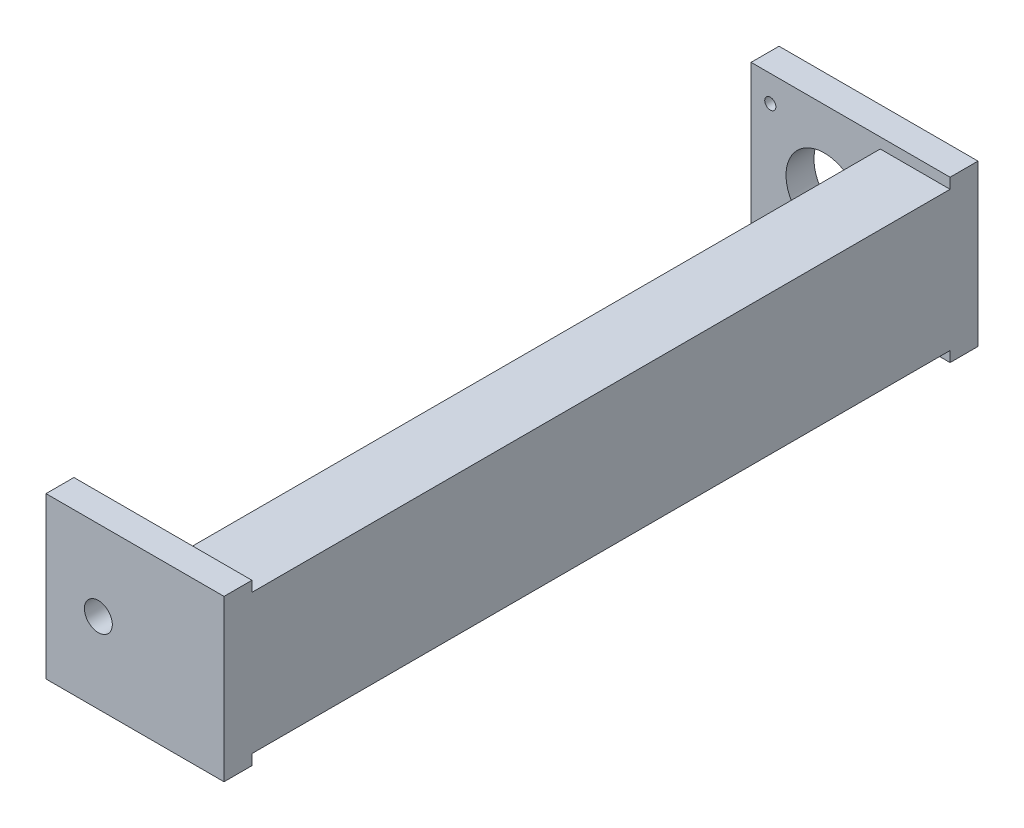
ISO-10303-21;
HEADER;
FILE_DESCRIPTION(('STEP AP214'),'2;1');
FILE_NAME('part.step','',(''),(''),'','','');
FILE_SCHEMA(('AUTOMOTIVE_DESIGN { 1 0 10303 214 1 1 1 1 }'));
ENDSEC;
DATA;
#1=APPLICATION_CONTEXT('core data for automotive mechanical design processes');
#2=APPLICATION_PROTOCOL_DEFINITION('international standard','automotive_design',2000,#1);
#3=PRODUCT_CONTEXT('',#1,'mechanical');
#4=PRODUCT('Part','Part','',(#3));
#5=PRODUCT_RELATED_PRODUCT_CATEGORY('part','',(#4));
#6=PRODUCT_DEFINITION_FORMATION('','',#4);
#7=PRODUCT_DEFINITION_CONTEXT('part definition',#1,'design');
#8=PRODUCT_DEFINITION('design','',#6,#7);
#9=PRODUCT_DEFINITION_SHAPE('','',#8);
#10=(LENGTH_UNIT() NAMED_UNIT(*) SI_UNIT(.MILLI.,.METRE.));
#11=(NAMED_UNIT(*) PLANE_ANGLE_UNIT() SI_UNIT($,.RADIAN.));
#12=(NAMED_UNIT(*) SI_UNIT($,.STERADIAN.) SOLID_ANGLE_UNIT());
#13=UNCERTAINTY_MEASURE_WITH_UNIT(LENGTH_MEASURE(1.E-05),#10,'distance_accuracy_value','');
#14=(GEOMETRIC_REPRESENTATION_CONTEXT(3) GLOBAL_UNCERTAINTY_ASSIGNED_CONTEXT((#13)) GLOBAL_UNIT_ASSIGNED_CONTEXT((#10,
#11,#12)) REPRESENTATION_CONTEXT('',''));
#15=CARTESIAN_POINT('',(0.,0.,0.));
#16=DIRECTION('',(0.,0.,1.));
#17=DIRECTION('',(1.,0.,0.));
#18=AXIS2_PLACEMENT_3D('',#15,#16,#17);
#19=CARTESIAN_POINT('',(0.,0.,8.));
#20=DIRECTION('',(0.,0.,-1.));
#21=DIRECTION('',(-1.,0.,0.));
#22=AXIS2_PLACEMENT_3D('',#19,#20,#21);
#23=PLANE('',#22);
#24=CARTESIAN_POINT('',(-23.,-15.5,8.));
#25=DIRECTION('',(0.,0.,1.));
#26=DIRECTION('',(1.,0.,0.));
#27=AXIS2_PLACEMENT_3D('',#24,#25,#26);
#28=CIRCLE('',#27,1.6);
#29=CARTESIAN_POINT('',(-21.4,-15.5,8.));
#30=VERTEX_POINT('',#29);
#31=EDGE_CURVE('E203',#30,#30,#28,.T.);
#32=ORIENTED_EDGE('',*,*,#31,.F.);
#33=EDGE_LOOP('',(#32));
#34=FACE_BOUND('',#33,.T.);
#35=CARTESIAN_POINT('',(-23.,15.5,8.));
#36=DIRECTION('',(0.,0.,1.));
#37=DIRECTION('',(1.,0.,0.));
#38=AXIS2_PLACEMENT_3D('',#35,#36,#37);
#39=CIRCLE('',#38,1.6);
#40=CARTESIAN_POINT('',(-21.4,15.5,8.));
#41=VERTEX_POINT('',#40);
#42=EDGE_CURVE('E222',#41,#41,#39,.T.);
#43=ORIENTED_EDGE('',*,*,#42,.F.);
#44=EDGE_LOOP('',(#43));
#45=FACE_BOUND('',#44,.T.);
#46=CARTESIAN_POINT('',(-7.5,0.,8.));
#47=DIRECTION('',(0.,0.,1.));
#48=DIRECTION('',(1.,0.,0.));
#49=AXIS2_PLACEMENT_3D('',#46,#47,#48);
#50=CIRCLE('',#49,11.);
#51=CARTESIAN_POINT('',(3.5,0.,8.));
#52=VERTEX_POINT('',#51);
#53=EDGE_CURVE('E228',#52,#52,#50,.T.);
#54=ORIENTED_EDGE('',*,*,#53,.F.);
#55=EDGE_LOOP('',(#54));
#56=FACE_BOUND('',#55,.T.);
#57=DIRECTION('',(0.,-1.,0.));
#58=VECTOR('',#57,1.);
#59=CARTESIAN_POINT('',(8.5,20.,8.));
#60=LINE('',#59,#58);
#61=CARTESIAN_POINT('',(8.5,13.9801315846429,8.));
#62=VERTEX_POINT('',#61);
#63=CARTESIAN_POINT('',(8.5,-13.9801315846429,8.));
#64=VERTEX_POINT('',#63);
#65=EDGE_CURVE('E11',#62,#64,#60,.T.);
#66=ORIENTED_EDGE('',*,*,#65,.F.);
#67=CARTESIAN_POINT('',(8.,15.5,8.));
#68=DIRECTION('',(0.,0.,1.));
#69=DIRECTION('',(1.,0.,0.));
#70=AXIS2_PLACEMENT_3D('',#67,#68,#69);
#71=CIRCLE('',#70,1.6);
#72=CARTESIAN_POINT('',(8.5,17.0198684153571,8.));
#73=VERTEX_POINT('',#72);
#74=EDGE_CURVE('E215',#73,#62,#71,.T.);
#75=ORIENTED_EDGE('',*,*,#74,.F.);
#76=CARTESIAN_POINT('',(8.5,20.,8.));
#77=VERTEX_POINT('',#76);
#78=EDGE_CURVE('E187',#77,#73,#60,.T.);
#79=ORIENTED_EDGE('',*,*,#78,.F.);
#80=DIRECTION('',(-1.,0.,0.));
#81=VECTOR('',#80,1.);
#82=CARTESIAN_POINT('',(28.5,20.,8.));
#83=LINE('',#82,#81);
#84=CARTESIAN_POINT('',(28.5,20.,8.));
#85=VERTEX_POINT('',#84);
#86=EDGE_CURVE('E169',#85,#77,#83,.T.);
#87=ORIENTED_EDGE('',*,*,#86,.F.);
#88=DIRECTION('',(0.,1.,0.));
#89=VECTOR('',#88,1.);
#90=CARTESIAN_POINT('',(28.5,-23.,8.));
#91=LINE('',#90,#89);
#92=CARTESIAN_POINT('',(28.5,23.,8.));
#93=VERTEX_POINT('',#92);
#94=EDGE_CURVE('E237',#85,#93,#91,.T.);
#95=ORIENTED_EDGE('',*,*,#94,.T.);
#96=DIRECTION('',(-1.,0.,0.));
#97=VECTOR('',#96,1.);
#98=CARTESIAN_POINT('',(-28.5,23.,8.));
#99=LINE('',#98,#97);
#100=CARTESIAN_POINT('',(-28.5,23.,8.));
#101=VERTEX_POINT('',#100);
#102=EDGE_CURVE('E236',#93,#101,#99,.T.);
#103=ORIENTED_EDGE('',*,*,#102,.T.);
#104=DIRECTION('',(0.,-1.,0.));
#105=VECTOR('',#104,1.);
#106=CARTESIAN_POINT('',(-28.5,-23.,8.));
#107=LINE('',#106,#105);
#108=CARTESIAN_POINT('',(-28.5,-23.,8.));
#109=VERTEX_POINT('',#108);
#110=EDGE_CURVE('E239',#101,#109,#107,.T.);
#111=ORIENTED_EDGE('',*,*,#110,.T.);
#112=DIRECTION('',(1.,0.,0.));
#113=VECTOR('',#112,1.);
#114=CARTESIAN_POINT('',(-28.5,-23.,8.));
#115=LINE('',#114,#113);
#116=CARTESIAN_POINT('',(28.5,-23.,8.));
#117=VERTEX_POINT('',#116);
#118=EDGE_CURVE('E241',#109,#117,#115,.T.);
#119=ORIENTED_EDGE('',*,*,#118,.T.);
#120=CARTESIAN_POINT('',(28.5,-20.,8.));
#121=VERTEX_POINT('',#120);
#122=EDGE_CURVE('E234',#117,#121,#91,.T.);
#123=ORIENTED_EDGE('',*,*,#122,.T.);
#124=DIRECTION('',(1.,0.,0.));
#125=VECTOR('',#124,1.);
#126=CARTESIAN_POINT('',(28.5,-20.,8.));
#127=LINE('',#126,#125);
#128=CARTESIAN_POINT('',(8.5,-20.,8.));
#129=VERTEX_POINT('',#128);
#130=EDGE_CURVE('E58',#129,#121,#127,.T.);
#131=ORIENTED_EDGE('',*,*,#130,.F.);
#132=CARTESIAN_POINT('',(8.5,-17.0198684153571,8.));
#133=VERTEX_POINT('',#132);
#134=EDGE_CURVE('E49',#133,#129,#60,.T.);
#135=ORIENTED_EDGE('',*,*,#134,.F.);
#136=CARTESIAN_POINT('',(8.,-15.5,8.));
#137=DIRECTION('',(0.,0.,1.));
#138=DIRECTION('',(1.,0.,0.));
#139=AXIS2_PLACEMENT_3D('',#136,#137,#138);
#140=CIRCLE('',#139,1.6);
#141=EDGE_CURVE('E209',#64,#133,#140,.T.);
#142=ORIENTED_EDGE('',*,*,#141,.F.);
#143=EDGE_LOOP('',(#66,#75,#79,#87,#95,#103,#111,#119,#123,#131,#135,#142));
#144=FACE_BOUND('',#143,.T.);
#145=ADVANCED_FACE('F40',(#34,#45,#56,#144),#23,.F.);
#146=CARTESIAN_POINT('',(0.,0.,0.));
#147=DIRECTION('',(0.,0.,-1.));
#148=DIRECTION('',(-1.,0.,0.));
#149=AXIS2_PLACEMENT_3D('',#146,#147,#148);
#150=PLANE('',#149);
#151=CARTESIAN_POINT('',(8.,-15.5,0.));
#152=DIRECTION('',(0.,0.,1.));
#153=DIRECTION('',(1.,0.,0.));
#154=AXIS2_PLACEMENT_3D('',#151,#152,#153);
#155=CIRCLE('',#154,1.6);
#156=CARTESIAN_POINT('',(9.6,-15.5,0.));
#157=VERTEX_POINT('',#156);
#158=EDGE_CURVE('E206',#157,#157,#155,.T.);
#159=ORIENTED_EDGE('',*,*,#158,.T.);
#160=EDGE_LOOP('',(#159));
#161=FACE_BOUND('',#160,.T.);
#162=CARTESIAN_POINT('',(-23.,15.5,0.));
#163=DIRECTION('',(0.,0.,1.));
#164=DIRECTION('',(1.,0.,0.));
#165=AXIS2_PLACEMENT_3D('',#162,#163,#164);
#166=CIRCLE('',#165,1.6);
#167=CARTESIAN_POINT('',(-21.4,15.5,0.));
#168=VERTEX_POINT('',#167);
#169=EDGE_CURVE('E218',#168,#168,#166,.T.);
#170=ORIENTED_EDGE('',*,*,#169,.T.);
#171=EDGE_LOOP('',(#170));
#172=FACE_BOUND('',#171,.T.);
#173=DIRECTION('',(0.,1.,0.));
#174=VECTOR('',#173,1.);
#175=CARTESIAN_POINT('',(28.5,-23.,0.));
#176=LINE('',#175,#174);
#177=CARTESIAN_POINT('',(28.5,-23.,0.));
#178=VERTEX_POINT('',#177);
#179=CARTESIAN_POINT('',(28.5,23.,0.));
#180=VERTEX_POINT('',#179);
#181=EDGE_CURVE('E231',#178,#180,#176,.T.);
#182=ORIENTED_EDGE('',*,*,#181,.F.);
#183=DIRECTION('',(1.,0.,0.));
#184=VECTOR('',#183,1.);
#185=CARTESIAN_POINT('',(-28.5,-23.,0.));
#186=LINE('',#185,#184);
#187=CARTESIAN_POINT('',(-28.5,-23.,0.));
#188=VERTEX_POINT('',#187);
#189=EDGE_CURVE('E249',#188,#178,#186,.T.);
#190=ORIENTED_EDGE('',*,*,#189,.F.);
#191=DIRECTION('',(0.,-1.,0.));
#192=VECTOR('',#191,1.);
#193=CARTESIAN_POINT('',(-28.5,-23.,0.));
#194=LINE('',#193,#192);
#195=CARTESIAN_POINT('',(-28.5,23.,0.));
#196=VERTEX_POINT('',#195);
#197=EDGE_CURVE('E247',#196,#188,#194,.T.);
#198=ORIENTED_EDGE('',*,*,#197,.F.);
#199=DIRECTION('',(-1.,0.,0.));
#200=VECTOR('',#199,1.);
#201=CARTESIAN_POINT('',(-28.5,23.,0.));
#202=LINE('',#201,#200);
#203=EDGE_CURVE('E245',#180,#196,#202,.T.);
#204=ORIENTED_EDGE('',*,*,#203,.F.);
#205=EDGE_LOOP('',(#182,#190,#198,#204));
#206=FACE_BOUND('',#205,.T.);
#207=CARTESIAN_POINT('',(-7.5,0.,0.));
#208=DIRECTION('',(0.,0.,1.));
#209=DIRECTION('',(1.,0.,0.));
#210=AXIS2_PLACEMENT_3D('',#207,#208,#209);
#211=CIRCLE('',#210,11.);
#212=CARTESIAN_POINT('',(3.5,0.,0.));
#213=VERTEX_POINT('',#212);
#214=EDGE_CURVE('E225',#213,#213,#211,.T.);
#215=ORIENTED_EDGE('',*,*,#214,.T.);
#216=EDGE_LOOP('',(#215));
#217=FACE_BOUND('',#216,.T.);
#218=CARTESIAN_POINT('',(8.,15.5,0.));
#219=DIRECTION('',(0.,0.,1.));
#220=DIRECTION('',(1.,0.,0.));
#221=AXIS2_PLACEMENT_3D('',#218,#219,#220);
#222=CIRCLE('',#221,1.6);
#223=CARTESIAN_POINT('',(9.6,15.5,0.));
#224=VERTEX_POINT('',#223);
#225=EDGE_CURVE('E211',#224,#224,#222,.T.);
#226=ORIENTED_EDGE('',*,*,#225,.T.);
#227=EDGE_LOOP('',(#226));
#228=FACE_BOUND('',#227,.T.);
#229=CARTESIAN_POINT('',(-23.,-15.5,0.));
#230=DIRECTION('',(0.,0.,1.));
#231=DIRECTION('',(1.,0.,0.));
#232=AXIS2_PLACEMENT_3D('',#229,#230,#231);
#233=CIRCLE('',#232,1.6);
#234=CARTESIAN_POINT('',(-21.4,-15.5,0.));
#235=VERTEX_POINT('',#234);
#236=EDGE_CURVE('E202',#235,#235,#233,.T.);
#237=ORIENTED_EDGE('',*,*,#236,.T.);
#238=EDGE_LOOP('',(#237));
#239=FACE_BOUND('',#238,.T.);
#240=ADVANCED_FACE('F288',(#161,#172,#206,#217,#228,#239),#150,.T.);
#241=CARTESIAN_POINT('',(28.5,-23.,8.));
#242=DIRECTION('',(-1.,0.,0.));
#243=DIRECTION('',(0.,0.,1.));
#244=AXIS2_PLACEMENT_3D('',#241,#242,#243);
#245=PLANE('',#244);
#246=ORIENTED_EDGE('',*,*,#181,.T.);
#247=DIRECTION('',(0.,0.,-1.));
#248=VECTOR('',#247,1.);
#249=CARTESIAN_POINT('',(28.5,23.,8.));
#250=LINE('',#249,#248);
#251=EDGE_CURVE('E44',#93,#180,#250,.T.);
#252=ORIENTED_EDGE('',*,*,#251,.F.);
#253=ORIENTED_EDGE('',*,*,#94,.F.);
#254=DIRECTION('',(0.,0.,-1.));
#255=VECTOR('',#254,1.);
#256=CARTESIAN_POINT('',(28.5,20.,208.));
#257=LINE('',#256,#255);
#258=CARTESIAN_POINT('',(28.5,20.,208.));
#259=VERTEX_POINT('',#258);
#260=EDGE_CURVE('E199',#259,#85,#257,.T.);
#261=ORIENTED_EDGE('',*,*,#260,.F.);
#262=DIRECTION('',(0.,1.,0.));
#263=VECTOR('',#262,1.);
#264=CARTESIAN_POINT('',(28.5,23.,208.));
#265=LINE('',#264,#263);
#266=CARTESIAN_POINT('',(28.5,23.,208.));
#267=VERTEX_POINT('',#266);
#268=EDGE_CURVE('E167',#259,#267,#265,.T.);
#269=ORIENTED_EDGE('',*,*,#268,.T.);
#270=DIRECTION('',(0.,0.,-1.));
#271=VECTOR('',#270,1.);
#272=CARTESIAN_POINT('',(28.5,23.,216.));
#273=LINE('',#272,#271);
#274=CARTESIAN_POINT('',(28.5,23.,216.));
#275=VERTEX_POINT('',#274);
#276=EDGE_CURVE('E146',#275,#267,#273,.T.);
#277=ORIENTED_EDGE('',*,*,#276,.F.);
#278=DIRECTION('',(0.,1.,0.));
#279=VECTOR('',#278,1.);
#280=CARTESIAN_POINT('',(28.5,23.,216.));
#281=LINE('',#280,#279);
#282=CARTESIAN_POINT('',(28.5,-23.,216.));
#283=VERTEX_POINT('',#282);
#284=EDGE_CURVE('E152',#283,#275,#281,.T.);
#285=ORIENTED_EDGE('',*,*,#284,.F.);
#286=DIRECTION('',(0.,0.,-1.));
#287=VECTOR('',#286,1.);
#288=CARTESIAN_POINT('',(28.5,-23.,216.));
#289=LINE('',#288,#287);
#290=CARTESIAN_POINT('',(28.5,-23.,208.));
#291=VERTEX_POINT('',#290);
#292=EDGE_CURVE('E297',#283,#291,#289,.T.);
#293=ORIENTED_EDGE('',*,*,#292,.T.);
#294=CARTESIAN_POINT('',(28.5,-20.,208.));
#295=VERTEX_POINT('',#294);
#296=EDGE_CURVE('E296',#291,#295,#265,.T.);
#297=ORIENTED_EDGE('',*,*,#296,.T.);
#298=DIRECTION('',(0.,0.,-1.));
#299=VECTOR('',#298,1.);
#300=CARTESIAN_POINT('',(28.5,-20.,208.));
#301=LINE('',#300,#299);
#302=EDGE_CURVE('E186',#295,#121,#301,.T.);
#303=ORIENTED_EDGE('',*,*,#302,.T.);
#304=ORIENTED_EDGE('',*,*,#122,.F.);
#305=DIRECTION('',(0.,0.,-1.));
#306=VECTOR('',#305,1.);
#307=CARTESIAN_POINT('',(28.5,-23.,8.));
#308=LINE('',#307,#306);
#309=EDGE_CURVE('E243',#117,#178,#308,.T.);
#310=ORIENTED_EDGE('',*,*,#309,.T.);
#311=EDGE_LOOP('',(#246,#252,#253,#261,#269,#277,#285,#293,#297,#303,#304,#310));
#312=FACE_BOUND('',#311,.T.);
#313=ADVANCED_FACE('F42',(#312),#245,.F.);
#314=CARTESIAN_POINT('',(-28.5,23.,8.));
#315=DIRECTION('',(0.,-1.,0.));
#316=DIRECTION('',(0.,0.,-1.));
#317=AXIS2_PLACEMENT_3D('',#314,#315,#316);
#318=PLANE('',#317);
#319=ORIENTED_EDGE('',*,*,#203,.T.);
#320=DIRECTION('',(0.,0.,-1.));
#321=VECTOR('',#320,1.);
#322=CARTESIAN_POINT('',(-28.5,23.,8.));
#323=LINE('',#322,#321);
#324=EDGE_CURVE('E255',#101,#196,#323,.T.);
#325=ORIENTED_EDGE('',*,*,#324,.F.);
#326=ORIENTED_EDGE('',*,*,#102,.F.);
#327=ORIENTED_EDGE('',*,*,#251,.T.);
#328=EDGE_LOOP('',(#319,#325,#326,#327));
#329=FACE_BOUND('',#328,.T.);
#330=ADVANCED_FACE('F290',(#329),#318,.F.);
#331=CARTESIAN_POINT('',(-28.5,-23.,8.));
#332=DIRECTION('',(1.,0.,0.));
#333=DIRECTION('',(0.,0.,-1.));
#334=AXIS2_PLACEMENT_3D('',#331,#332,#333);
#335=PLANE('',#334);
#336=ORIENTED_EDGE('',*,*,#197,.T.);
#337=DIRECTION('',(0.,0.,-1.));
#338=VECTOR('',#337,1.);
#339=CARTESIAN_POINT('',(-28.5,-23.,8.));
#340=LINE('',#339,#338);
#341=EDGE_CURVE('E253',#109,#188,#340,.T.);
#342=ORIENTED_EDGE('',*,*,#341,.F.);
#343=ORIENTED_EDGE('',*,*,#110,.F.);
#344=ORIENTED_EDGE('',*,*,#324,.T.);
#345=EDGE_LOOP('',(#336,#342,#343,#344));
#346=FACE_BOUND('',#345,.T.);
#347=ADVANCED_FACE('F292',(#346),#335,.F.);
#348=CARTESIAN_POINT('',(-28.5,-23.,8.));
#349=DIRECTION('',(0.,1.,0.));
#350=DIRECTION('',(0.,0.,1.));
#351=AXIS2_PLACEMENT_3D('',#348,#349,#350);
#352=PLANE('',#351);
#353=ORIENTED_EDGE('',*,*,#189,.T.);
#354=ORIENTED_EDGE('',*,*,#309,.F.);
#355=ORIENTED_EDGE('',*,*,#118,.F.);
#356=ORIENTED_EDGE('',*,*,#341,.T.);
#357=EDGE_LOOP('',(#353,#354,#355,#356));
#358=FACE_BOUND('',#357,.T.);
#359=ADVANCED_FACE('F295',(#358),#352,.F.);
#360=CARTESIAN_POINT('',(-7.5,0.,8.));
#361=DIRECTION('',(0.,0.,-1.));
#362=DIRECTION('',(-1.,0.,0.));
#363=AXIS2_PLACEMENT_3D('',#360,#361,#362);
#364=CYLINDRICAL_SURFACE('',#363,11.);
#365=ORIENTED_EDGE('',*,*,#53,.T.);
#366=EDGE_LOOP('',(#365));
#367=FACE_BOUND('',#366,.T.);
#368=ORIENTED_EDGE('',*,*,#214,.F.);
#369=EDGE_LOOP('',(#368));
#370=FACE_BOUND('',#369,.T.);
#371=ADVANCED_FACE('F345',(#367,#370),#364,.F.);
#372=CARTESIAN_POINT('',(-23.,15.5,8.));
#373=DIRECTION('',(0.,0.,-1.));
#374=DIRECTION('',(-1.,0.,0.));
#375=AXIS2_PLACEMENT_3D('',#372,#373,#374);
#376=CYLINDRICAL_SURFACE('',#375,1.6);
#377=ORIENTED_EDGE('',*,*,#42,.T.);
#378=EDGE_LOOP('',(#377));
#379=FACE_BOUND('',#378,.T.);
#380=ORIENTED_EDGE('',*,*,#169,.F.);
#381=EDGE_LOOP('',(#380));
#382=FACE_BOUND('',#381,.T.);
#383=ADVANCED_FACE('F389',(#379,#382),#376,.F.);
#384=CARTESIAN_POINT('',(8.,15.5,8.));
#385=DIRECTION('',(0.,0.,-1.));
#386=DIRECTION('',(-1.,0.,0.));
#387=AXIS2_PLACEMENT_3D('',#384,#385,#386);
#388=CYLINDRICAL_SURFACE('',#387,1.6);
#389=ORIENTED_EDGE('',*,*,#74,.T.);
#390=EDGE_CURVE('E219',#62,#73,#71,.T.);
#391=ORIENTED_EDGE('',*,*,#390,.T.);
#392=EDGE_LOOP('',(#389,#391));
#393=FACE_BOUND('',#392,.T.);
#394=ORIENTED_EDGE('',*,*,#225,.F.);
#395=EDGE_LOOP('',(#394));
#396=FACE_BOUND('',#395,.T.);
#397=ADVANCED_FACE('F398',(#393,#396),#388,.F.);
#398=CARTESIAN_POINT('',(8.,-15.5,8.));
#399=DIRECTION('',(0.,0.,-1.));
#400=DIRECTION('',(-1.,0.,0.));
#401=AXIS2_PLACEMENT_3D('',#398,#399,#400);
#402=CYLINDRICAL_SURFACE('',#401,1.6);
#403=ORIENTED_EDGE('',*,*,#141,.T.);
#404=EDGE_CURVE('E212',#133,#64,#140,.T.);
#405=ORIENTED_EDGE('',*,*,#404,.T.);
#406=EDGE_LOOP('',(#403,#405));
#407=FACE_BOUND('',#406,.T.);
#408=ORIENTED_EDGE('',*,*,#158,.F.);
#409=EDGE_LOOP('',(#408));
#410=FACE_BOUND('',#409,.T.);
#411=ADVANCED_FACE('F410',(#407,#410),#402,.F.);
#412=CARTESIAN_POINT('',(-23.,-15.5,8.));
#413=DIRECTION('',(0.,0.,-1.));
#414=DIRECTION('',(-1.,0.,0.));
#415=AXIS2_PLACEMENT_3D('',#412,#413,#414);
#416=CYLINDRICAL_SURFACE('',#415,1.6);
#417=ORIENTED_EDGE('',*,*,#31,.T.);
#418=EDGE_LOOP('',(#417));
#419=FACE_BOUND('',#418,.T.);
#420=ORIENTED_EDGE('',*,*,#236,.F.);
#421=EDGE_LOOP('',(#420));
#422=FACE_BOUND('',#421,.T.);
#423=ADVANCED_FACE('F405',(#419,#422),#416,.F.);
#424=CARTESIAN_POINT('',(0.,0.,8.));
#425=DIRECTION('',(0.,0.,-1.));
#426=DIRECTION('',(-1.,0.,0.));
#427=AXIS2_PLACEMENT_3D('',#424,#425,#426);
#428=PLANE('',#427);
#429=ORIENTED_EDGE('',*,*,#390,.F.);
#430=EDGE_CURVE('E51',#73,#62,#60,.T.);
#431=ORIENTED_EDGE('',*,*,#430,.F.);
#432=EDGE_LOOP('',(#429,#431));
#433=FACE_BOUND('',#432,.T.);
#434=ADVANCED_FACE('F409',(#433),#428,.T.);
#435=ORIENTED_EDGE('',*,*,#404,.F.);
#436=EDGE_CURVE('E172',#64,#133,#60,.T.);
#437=ORIENTED_EDGE('',*,*,#436,.F.);
#438=EDGE_LOOP('',(#435,#437));
#439=FACE_BOUND('',#438,.T.);
#440=ADVANCED_FACE('F441',(#439),#428,.T.);
#441=CARTESIAN_POINT('',(28.5,20.,208.));
#442=DIRECTION('',(0.,-1.,0.));
#443=DIRECTION('',(1.,0.,0.));
#444=AXIS2_PLACEMENT_3D('',#441,#442,#443);
#445=PLANE('',#444);
#446=ORIENTED_EDGE('',*,*,#86,.T.);
#447=DIRECTION('',(0.,0.,-1.));
#448=VECTOR('',#447,1.);
#449=CARTESIAN_POINT('',(8.5,20.,208.));
#450=LINE('',#449,#448);
#451=CARTESIAN_POINT('',(8.5,20.,208.));
#452=VERTEX_POINT('',#451);
#453=EDGE_CURVE('E196',#452,#77,#450,.T.);
#454=ORIENTED_EDGE('',*,*,#453,.F.);
#455=DIRECTION('',(-1.,0.,0.));
#456=VECTOR('',#455,1.);
#457=CARTESIAN_POINT('',(28.5,20.,208.));
#458=LINE('',#457,#456);
#459=EDGE_CURVE('E178',#259,#452,#458,.T.);
#460=ORIENTED_EDGE('',*,*,#459,.F.);
#461=ORIENTED_EDGE('',*,*,#260,.T.);
#462=EDGE_LOOP('',(#446,#454,#460,#461));
#463=FACE_BOUND('',#462,.T.);
#464=ADVANCED_FACE('F280',(#463),#445,.F.);
#465=CARTESIAN_POINT('',(8.5,20.,208.));
#466=DIRECTION('',(1.,0.,0.));
#467=DIRECTION('',(0.,1.,0.));
#468=AXIS2_PLACEMENT_3D('',#465,#466,#467);
#469=PLANE('',#468);
#470=ORIENTED_EDGE('',*,*,#78,.T.);
#471=ORIENTED_EDGE('',*,*,#430,.T.);
#472=ORIENTED_EDGE('',*,*,#65,.T.);
#473=ORIENTED_EDGE('',*,*,#436,.T.);
#474=ORIENTED_EDGE('',*,*,#134,.T.);
#475=DIRECTION('',(0.,0.,-1.));
#476=VECTOR('',#475,1.);
#477=CARTESIAN_POINT('',(8.5,-20.,208.));
#478=LINE('',#477,#476);
#479=CARTESIAN_POINT('',(8.5,-20.,208.));
#480=VERTEX_POINT('',#479);
#481=EDGE_CURVE('E193',#480,#129,#478,.T.);
#482=ORIENTED_EDGE('',*,*,#481,.F.);
#483=DIRECTION('',(0.,-1.,0.));
#484=VECTOR('',#483,1.);
#485=CARTESIAN_POINT('',(8.5,20.,208.));
#486=LINE('',#485,#484);
#487=EDGE_CURVE('E181',#452,#480,#486,.T.);
#488=ORIENTED_EDGE('',*,*,#487,.F.);
#489=ORIENTED_EDGE('',*,*,#453,.T.);
#490=EDGE_LOOP('',(#470,#471,#472,#473,#474,#482,#488,#489));
#491=FACE_BOUND('',#490,.T.);
#492=ADVANCED_FACE('F267',(#491),#469,.F.);
#493=CARTESIAN_POINT('',(28.5,-20.,208.));
#494=DIRECTION('',(0.,1.,0.));
#495=DIRECTION('',(-1.,0.,0.));
#496=AXIS2_PLACEMENT_3D('',#493,#494,#495);
#497=PLANE('',#496);
#498=ORIENTED_EDGE('',*,*,#130,.T.);
#499=ORIENTED_EDGE('',*,*,#302,.F.);
#500=DIRECTION('',(1.,0.,0.));
#501=VECTOR('',#500,1.);
#502=CARTESIAN_POINT('',(28.5,-20.,208.));
#503=LINE('',#502,#501);
#504=EDGE_CURVE('E184',#480,#295,#503,.T.);
#505=ORIENTED_EDGE('',*,*,#504,.F.);
#506=ORIENTED_EDGE('',*,*,#481,.T.);
#507=EDGE_LOOP('',(#498,#499,#505,#506));
#508=FACE_BOUND('',#507,.T.);
#509=ADVANCED_FACE('F272',(#508),#497,.F.);
#510=CARTESIAN_POINT('',(0.,0.,216.));
#511=DIRECTION('',(0.,0.,-1.));
#512=DIRECTION('',(-1.,0.,0.));
#513=AXIS2_PLACEMENT_3D('',#510,#511,#512);
#514=PLANE('',#513);
#515=ORIENTED_EDGE('',*,*,#284,.T.);
#516=DIRECTION('',(-1.,0.,0.));
#517=VECTOR('',#516,1.);
#518=CARTESIAN_POINT('',(28.5,23.,216.));
#519=LINE('',#518,#517);
#520=CARTESIAN_POINT('',(-22.5,23.,216.));
#521=VERTEX_POINT('',#520);
#522=EDGE_CURVE('E142',#275,#521,#519,.T.);
#523=ORIENTED_EDGE('',*,*,#522,.T.);
#524=DIRECTION('',(0.,-1.,0.));
#525=VECTOR('',#524,1.);
#526=CARTESIAN_POINT('',(-22.5,23.,216.));
#527=LINE('',#526,#525);
#528=CARTESIAN_POINT('',(-22.5,-23.,216.));
#529=VERTEX_POINT('',#528);
#530=EDGE_CURVE('E151',#521,#529,#527,.T.);
#531=ORIENTED_EDGE('',*,*,#530,.T.);
#532=DIRECTION('',(1.,0.,0.));
#533=VECTOR('',#532,1.);
#534=CARTESIAN_POINT('',(28.5,-23.,216.));
#535=LINE('',#534,#533);
#536=EDGE_CURVE('E158',#529,#283,#535,.T.);
#537=ORIENTED_EDGE('',*,*,#536,.T.);
#538=EDGE_LOOP('',(#515,#523,#531,#537));
#539=FACE_BOUND('',#538,.T.);
#540=CARTESIAN_POINT('',(-7.5,0.,216.));
#541=DIRECTION('',(0.,0.,1.));
#542=DIRECTION('',(1.,0.,0.));
#543=AXIS2_PLACEMENT_3D('',#540,#541,#542);
#544=CIRCLE('',#543,4.);
#545=CARTESIAN_POINT('',(-3.5,0.,216.));
#546=VERTEX_POINT('',#545);
#547=EDGE_CURVE('E303',#546,#546,#544,.T.);
#548=ORIENTED_EDGE('',*,*,#547,.F.);
#549=EDGE_LOOP('',(#548));
#550=FACE_BOUND('',#549,.T.);
#551=ADVANCED_FACE('F155',(#539,#550),#514,.F.);
#552=CARTESIAN_POINT('',(0.,0.,208.));
#553=DIRECTION('',(0.,0.,-1.));
#554=DIRECTION('',(-1.,0.,0.));
#555=AXIS2_PLACEMENT_3D('',#552,#553,#554);
#556=PLANE('',#555);
#557=ORIENTED_EDGE('',*,*,#268,.F.);
#558=ORIENTED_EDGE('',*,*,#459,.T.);
#559=ORIENTED_EDGE('',*,*,#487,.T.);
#560=ORIENTED_EDGE('',*,*,#504,.T.);
#561=ORIENTED_EDGE('',*,*,#296,.F.);
#562=DIRECTION('',(1.,0.,0.));
#563=VECTOR('',#562,1.);
#564=CARTESIAN_POINT('',(28.5,-23.,208.));
#565=LINE('',#564,#563);
#566=CARTESIAN_POINT('',(-22.5,-23.,208.));
#567=VERTEX_POINT('',#566);
#568=EDGE_CURVE('E162',#567,#291,#565,.T.);
#569=ORIENTED_EDGE('',*,*,#568,.F.);
#570=DIRECTION('',(0.,-1.,0.));
#571=VECTOR('',#570,1.);
#572=CARTESIAN_POINT('',(-22.5,23.,208.));
#573=LINE('',#572,#571);
#574=CARTESIAN_POINT('',(-22.5,23.,208.));
#575=VERTEX_POINT('',#574);
#576=EDGE_CURVE('E301',#575,#567,#573,.T.);
#577=ORIENTED_EDGE('',*,*,#576,.F.);
#578=DIRECTION('',(-1.,0.,0.));
#579=VECTOR('',#578,1.);
#580=CARTESIAN_POINT('',(28.5,23.,208.));
#581=LINE('',#580,#579);
#582=EDGE_CURVE('E299',#267,#575,#581,.T.);
#583=ORIENTED_EDGE('',*,*,#582,.F.);
#584=EDGE_LOOP('',(#557,#558,#559,#560,#561,#569,#577,#583));
#585=FACE_BOUND('',#584,.T.);
#586=CARTESIAN_POINT('',(-7.5,0.,208.));
#587=DIRECTION('',(0.,0.,1.));
#588=DIRECTION('',(1.,0.,0.));
#589=AXIS2_PLACEMENT_3D('',#586,#587,#588);
#590=CIRCLE('',#589,4.);
#591=CARTESIAN_POINT('',(-3.5,0.,208.));
#592=VERTEX_POINT('',#591);
#593=EDGE_CURVE('E317',#592,#592,#590,.T.);
#594=ORIENTED_EDGE('',*,*,#593,.T.);
#595=EDGE_LOOP('',(#594));
#596=FACE_BOUND('',#595,.T.);
#597=ADVANCED_FACE('F276',(#585,#596),#556,.T.);
#598=CARTESIAN_POINT('',(28.5,23.,216.));
#599=DIRECTION('',(0.,-1.,0.));
#600=DIRECTION('',(1.,0.,0.));
#601=AXIS2_PLACEMENT_3D('',#598,#599,#600);
#602=PLANE('',#601);
#603=ORIENTED_EDGE('',*,*,#582,.T.);
#604=DIRECTION('',(0.,0.,-1.));
#605=VECTOR('',#604,1.);
#606=CARTESIAN_POINT('',(-22.5,23.,216.));
#607=LINE('',#606,#605);
#608=EDGE_CURVE('E148',#521,#575,#607,.T.);
#609=ORIENTED_EDGE('',*,*,#608,.F.);
#610=ORIENTED_EDGE('',*,*,#522,.F.);
#611=ORIENTED_EDGE('',*,*,#276,.T.);
#612=EDGE_LOOP('',(#603,#609,#610,#611));
#613=FACE_BOUND('',#612,.T.);
#614=ADVANCED_FACE('F144',(#613),#602,.F.);
#615=CARTESIAN_POINT('',(-22.5,23.,216.));
#616=DIRECTION('',(1.,0.,0.));
#617=DIRECTION('',(0.,0.,-1.));
#618=AXIS2_PLACEMENT_3D('',#615,#616,#617);
#619=PLANE('',#618);
#620=ORIENTED_EDGE('',*,*,#576,.T.);
#621=DIRECTION('',(0.,0.,-1.));
#622=VECTOR('',#621,1.);
#623=CARTESIAN_POINT('',(-22.5,-23.,216.));
#624=LINE('',#623,#622);
#625=EDGE_CURVE('E174',#529,#567,#624,.T.);
#626=ORIENTED_EDGE('',*,*,#625,.F.);
#627=ORIENTED_EDGE('',*,*,#530,.F.);
#628=ORIENTED_EDGE('',*,*,#608,.T.);
#629=EDGE_LOOP('',(#620,#626,#627,#628));
#630=FACE_BOUND('',#629,.T.);
#631=ADVANCED_FACE('F315',(#630),#619,.F.);
#632=CARTESIAN_POINT('',(28.5,-23.,216.));
#633=DIRECTION('',(0.,1.,0.));
#634=DIRECTION('',(-1.,0.,0.));
#635=AXIS2_PLACEMENT_3D('',#632,#633,#634);
#636=PLANE('',#635);
#637=ORIENTED_EDGE('',*,*,#568,.T.);
#638=ORIENTED_EDGE('',*,*,#292,.F.);
#639=ORIENTED_EDGE('',*,*,#536,.F.);
#640=ORIENTED_EDGE('',*,*,#625,.T.);
#641=EDGE_LOOP('',(#637,#638,#639,#640));
#642=FACE_BOUND('',#641,.T.);
#643=ADVANCED_FACE('F312',(#642),#636,.F.);
#644=CARTESIAN_POINT('',(-7.5,0.,216.));
#645=DIRECTION('',(0.,0.,-1.));
#646=DIRECTION('',(-1.,0.,0.));
#647=AXIS2_PLACEMENT_3D('',#644,#645,#646);
#648=CYLINDRICAL_SURFACE('',#647,4.);
#649=ORIENTED_EDGE('',*,*,#547,.T.);
#650=EDGE_LOOP('',(#649));
#651=FACE_BOUND('',#650,.T.);
#652=ORIENTED_EDGE('',*,*,#593,.F.);
#653=EDGE_LOOP('',(#652));
#654=FACE_BOUND('',#653,.T.);
#655=ADVANCED_FACE('F323',(#651,#654),#648,.F.);
#656=CLOSED_SHELL('',(#145,#240,#313,#330,#347,#359,#371,#383,#397,#411,#423,#434,#440,#464,
#492,#509,#551,#597,#614,#631,#643,#655));
#657=MANIFOLD_SOLID_BREP('B2',#656);
#658=ADVANCED_BREP_SHAPE_REPRESENTATION('',(#18,#657),#14);
#659=SHAPE_DEFINITION_REPRESENTATION(#9,#658);
ENDSEC;
END-ISO-10303-21;
